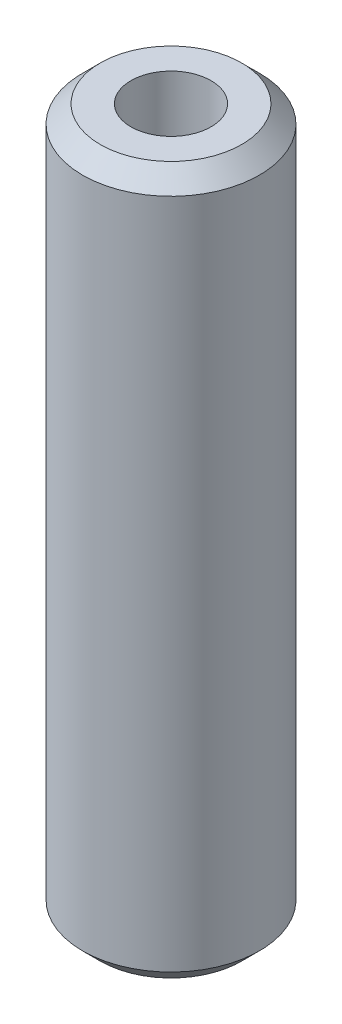
ISO-10303-21;
HEADER;
FILE_DESCRIPTION(('STEP AP214'),'2;1');
FILE_NAME('part.step','',(''),(''),'','','');
FILE_SCHEMA(('AUTOMOTIVE_DESIGN { 1 0 10303 214 1 1 1 1 }'));
ENDSEC;
DATA;
#1=APPLICATION_CONTEXT('core data for automotive mechanical design processes');
#2=APPLICATION_PROTOCOL_DEFINITION('international standard','automotive_design',2000,#1);
#3=PRODUCT_CONTEXT('',#1,'mechanical');
#4=PRODUCT('Part','Part','',(#3));
#5=PRODUCT_RELATED_PRODUCT_CATEGORY('part','',(#4));
#6=PRODUCT_DEFINITION_FORMATION('','',#4);
#7=PRODUCT_DEFINITION_CONTEXT('part definition',#1,'design');
#8=PRODUCT_DEFINITION('design','',#6,#7);
#9=PRODUCT_DEFINITION_SHAPE('','',#8);
#10=(LENGTH_UNIT() NAMED_UNIT(*) SI_UNIT(.MILLI.,.METRE.));
#11=(NAMED_UNIT(*) PLANE_ANGLE_UNIT() SI_UNIT($,.RADIAN.));
#12=(NAMED_UNIT(*) SI_UNIT($,.STERADIAN.) SOLID_ANGLE_UNIT());
#13=UNCERTAINTY_MEASURE_WITH_UNIT(LENGTH_MEASURE(1.E-05),#10,'distance_accuracy_value','');
#14=(GEOMETRIC_REPRESENTATION_CONTEXT(3) GLOBAL_UNCERTAINTY_ASSIGNED_CONTEXT((#13)) GLOBAL_UNIT_ASSIGNED_CONTEXT((#10,
#11,#12)) REPRESENTATION_CONTEXT('',''));
#15=CARTESIAN_POINT('',(0.,0.,0.));
#16=DIRECTION('',(0.,0.,1.));
#17=DIRECTION('',(1.,0.,0.));
#18=AXIS2_PLACEMENT_3D('',#15,#16,#17);
#19=CARTESIAN_POINT('',(0.,101.6,0.));
#20=DIRECTION('',(0.,-1.,0.));
#21=DIRECTION('',(0.,0.,-1.));
#22=AXIS2_PLACEMENT_3D('',#19,#20,#21);
#23=CYLINDRICAL_SURFACE('',#22,12.7);
#24=CARTESIAN_POINT('',(0.,99.06,0.));
#25=DIRECTION('',(0.,1.,0.));
#26=DIRECTION('',(0.,0.,1.));
#27=AXIS2_PLACEMENT_3D('',#24,#25,#26);
#28=CIRCLE('',#27,12.7);
#29=CARTESIAN_POINT('',(0.,99.06,12.7));
#30=VERTEX_POINT('',#29);
#31=EDGE_CURVE('E44',#30,#30,#28,.F.);
#32=ORIENTED_EDGE('',*,*,#31,.T.);
#33=EDGE_LOOP('',(#32));
#34=FACE_BOUND('',#33,.T.);
#35=CARTESIAN_POINT('',(0.,2.54000000000001,0.));
#36=DIRECTION('',(0.,1.,0.));
#37=DIRECTION('',(0.,0.,1.));
#38=AXIS2_PLACEMENT_3D('',#35,#36,#37);
#39=CIRCLE('',#38,12.7);
#40=CARTESIAN_POINT('',(0.,2.54000000000001,12.7));
#41=VERTEX_POINT('',#40);
#42=EDGE_CURVE('E74',#41,#41,#39,.T.);
#43=ORIENTED_EDGE('',*,*,#42,.T.);
#44=EDGE_LOOP('',(#43));
#45=FACE_BOUND('',#44,.T.);
#46=ADVANCED_FACE('F36',(#34,#45),#23,.T.);
#47=CARTESIAN_POINT('',(0.,101.6,0.));
#48=DIRECTION('',(0.,1.,0.));
#49=DIRECTION('',(0.,0.,1.));
#50=AXIS2_PLACEMENT_3D('',#47,#48,#49);
#51=PLANE('',#50);
#52=CARTESIAN_POINT('',(0.,101.6,0.));
#53=DIRECTION('',(0.,1.,0.));
#54=DIRECTION('',(0.,0.,1.));
#55=AXIS2_PLACEMENT_3D('',#52,#53,#54);
#56=CIRCLE('',#55,10.16);
#57=CARTESIAN_POINT('',(0.,101.6,10.16));
#58=VERTEX_POINT('',#57);
#59=EDGE_CURVE('E71',#58,#58,#56,.T.);
#60=ORIENTED_EDGE('',*,*,#59,.T.);
#61=EDGE_LOOP('',(#60));
#62=FACE_BOUND('',#61,.T.);
#63=CARTESIAN_POINT('',(0.,101.6,0.));
#64=DIRECTION('',(0.,1.,0.));
#65=DIRECTION('',(0.,0.,1.));
#66=AXIS2_PLACEMENT_3D('',#63,#64,#65);
#67=CIRCLE('',#66,5.75436999999999);
#68=CARTESIAN_POINT('',(0.,101.6,5.75436999999999));
#69=VERTEX_POINT('',#68);
#70=EDGE_CURVE('E60',#69,#69,#67,.T.);
#71=ORIENTED_EDGE('',*,*,#70,.F.);
#72=EDGE_LOOP('',(#71));
#73=FACE_BOUND('',#72,.T.);
#74=ADVANCED_FACE('F86',(#62,#73),#51,.T.);
#75=CARTESIAN_POINT('',(0.,0.,0.));
#76=DIRECTION('',(0.,1.,0.));
#77=DIRECTION('',(0.,0.,1.));
#78=AXIS2_PLACEMENT_3D('',#75,#76,#77);
#79=PLANE('',#78);
#80=CARTESIAN_POINT('',(0.,0.,0.));
#81=DIRECTION('',(0.,1.,0.));
#82=DIRECTION('',(0.,0.,1.));
#83=AXIS2_PLACEMENT_3D('',#80,#81,#82);
#84=CIRCLE('',#83,10.16);
#85=CARTESIAN_POINT('',(0.,0.,10.16));
#86=VERTEX_POINT('',#85);
#87=EDGE_CURVE('E11',#86,#86,#84,.F.);
#88=ORIENTED_EDGE('',*,*,#87,.T.);
#89=EDGE_LOOP('',(#88));
#90=FACE_BOUND('',#89,.T.);
#91=CARTESIAN_POINT('',(0.,0.,0.));
#92=DIRECTION('',(0.,-1.,0.));
#93=DIRECTION('',(0.,0.,-1.));
#94=AXIS2_PLACEMENT_3D('',#91,#92,#93);
#95=CIRCLE('',#94,5.75436999999999);
#96=CARTESIAN_POINT('',(0.,0.,-5.75436999999999));
#97=VERTEX_POINT('',#96);
#98=EDGE_CURVE('E61',#97,#97,#95,.T.);
#99=ORIENTED_EDGE('',*,*,#98,.F.);
#100=EDGE_LOOP('',(#99));
#101=FACE_BOUND('',#100,.T.);
#102=ADVANCED_FACE('F89',(#90,#101),#79,.F.);
#103=CARTESIAN_POINT('',(0.,63.5,0.));
#104=DIRECTION('',(0.,1.,0.));
#105=DIRECTION('',(0.,0.,1.));
#106=AXIS2_PLACEMENT_3D('',#103,#104,#105);
#107=CONICAL_SURFACE('',#106,5.75436999999999,1.02974425867665);
#108=CARTESIAN_POINT('',(0.,60.0424256796864,0.));
#109=VERTEX_POINT('',#108);
#110=VERTEX_LOOP('',#109);
#111=FACE_BOUND('',#110,.T.);
#112=CARTESIAN_POINT('',(0.,63.5,0.));
#113=DIRECTION('',(0.,1.,0.));
#114=DIRECTION('',(0.,0.,1.));
#115=AXIS2_PLACEMENT_3D('',#112,#113,#114);
#116=CIRCLE('',#115,5.75436999999999);
#117=CARTESIAN_POINT('',(0.,63.5,5.75436999999999));
#118=VERTEX_POINT('',#117);
#119=EDGE_CURVE('E64',#118,#118,#116,.T.);
#120=ORIENTED_EDGE('',*,*,#119,.T.);
#121=EDGE_LOOP('',(#120));
#122=FACE_BOUND('',#121,.T.);
#123=ADVANCED_FACE('F94',(#111,#122),#107,.F.);
#124=CARTESIAN_POINT('',(0.,101.6,0.));
#125=DIRECTION('',(0.,1.,0.));
#126=DIRECTION('',(0.,0.,1.));
#127=AXIS2_PLACEMENT_3D('',#124,#125,#126);
#128=CYLINDRICAL_SURFACE('',#127,5.75436999999999);
#129=ORIENTED_EDGE('',*,*,#119,.F.);
#130=EDGE_LOOP('',(#129));
#131=FACE_BOUND('',#130,.T.);
#132=ORIENTED_EDGE('',*,*,#70,.T.);
#133=EDGE_LOOP('',(#132));
#134=FACE_BOUND('',#133,.T.);
#135=ADVANCED_FACE('F54',(#131,#134),#128,.F.);
#136=CARTESIAN_POINT('',(0.,38.1,0.));
#137=DIRECTION('',(0.,-1.,0.));
#138=DIRECTION('',(0.,0.,-1.));
#139=AXIS2_PLACEMENT_3D('',#136,#137,#138);
#140=CONICAL_SURFACE('',#139,5.75436999999999,1.02974425867665);
#141=CARTESIAN_POINT('',(0.,41.5575743203136,0.));
#142=VERTEX_POINT('',#141);
#143=VERTEX_LOOP('',#142);
#144=FACE_BOUND('',#143,.T.);
#145=CARTESIAN_POINT('',(0.,38.1,0.));
#146=DIRECTION('',(0.,-1.,0.));
#147=DIRECTION('',(0.,0.,-1.));
#148=AXIS2_PLACEMENT_3D('',#145,#146,#147);
#149=CIRCLE('',#148,5.75436999999999);
#150=CARTESIAN_POINT('',(0.,38.1,-5.75436999999999));
#151=VERTEX_POINT('',#150);
#152=EDGE_CURVE('E58',#151,#151,#149,.T.);
#153=ORIENTED_EDGE('',*,*,#152,.T.);
#154=EDGE_LOOP('',(#153));
#155=FACE_BOUND('',#154,.T.);
#156=ADVANCED_FACE('F50',(#144,#155),#140,.F.);
#157=CARTESIAN_POINT('',(0.,0.,0.));
#158=DIRECTION('',(0.,-1.,0.));
#159=DIRECTION('',(0.,0.,-1.));
#160=AXIS2_PLACEMENT_3D('',#157,#158,#159);
#161=CYLINDRICAL_SURFACE('',#160,5.75436999999999);
#162=ORIENTED_EDGE('',*,*,#152,.F.);
#163=EDGE_LOOP('',(#162));
#164=FACE_BOUND('',#163,.T.);
#165=ORIENTED_EDGE('',*,*,#98,.T.);
#166=EDGE_LOOP('',(#165));
#167=FACE_BOUND('',#166,.T.);
#168=ADVANCED_FACE('F53',(#164,#167),#161,.F.);
#169=CARTESIAN_POINT('',(0.,101.6,0.));
#170=DIRECTION('',(0.,-1.,0.));
#171=DIRECTION('',(0.,0.,-1.));
#172=AXIS2_PLACEMENT_3D('',#169,#170,#171);
#173=CONICAL_SURFACE('',#172,10.16,0.785398163397445);
#174=ORIENTED_EDGE('',*,*,#31,.F.);
#175=EDGE_LOOP('',(#174));
#176=FACE_BOUND('',#175,.T.);
#177=ORIENTED_EDGE('',*,*,#59,.F.);
#178=EDGE_LOOP('',(#177));
#179=FACE_BOUND('',#178,.T.);
#180=ADVANCED_FACE('F81',(#176,#179),#173,.T.);
#181=CARTESIAN_POINT('',(0.,2.54000000000001,0.));
#182=DIRECTION('',(0.,1.,0.));
#183=DIRECTION('',(0.,0.,1.));
#184=AXIS2_PLACEMENT_3D('',#181,#182,#183);
#185=CONICAL_SURFACE('',#184,12.7,0.78539816339745);
#186=ORIENTED_EDGE('',*,*,#87,.F.);
#187=EDGE_LOOP('',(#186));
#188=FACE_BOUND('',#187,.T.);
#189=ORIENTED_EDGE('',*,*,#42,.F.);
#190=EDGE_LOOP('',(#189));
#191=FACE_BOUND('',#190,.T.);
#192=ADVANCED_FACE('F38',(#188,#191),#185,.T.);
#193=CLOSED_SHELL('',(#46,#74,#102,#123,#135,#156,#168,#180,#192));
#194=MANIFOLD_SOLID_BREP('B2',#193);
#195=ADVANCED_BREP_SHAPE_REPRESENTATION('',(#18,#194),#14);
#196=SHAPE_DEFINITION_REPRESENTATION(#9,#195);
ENDSEC;
END-ISO-10303-21;
